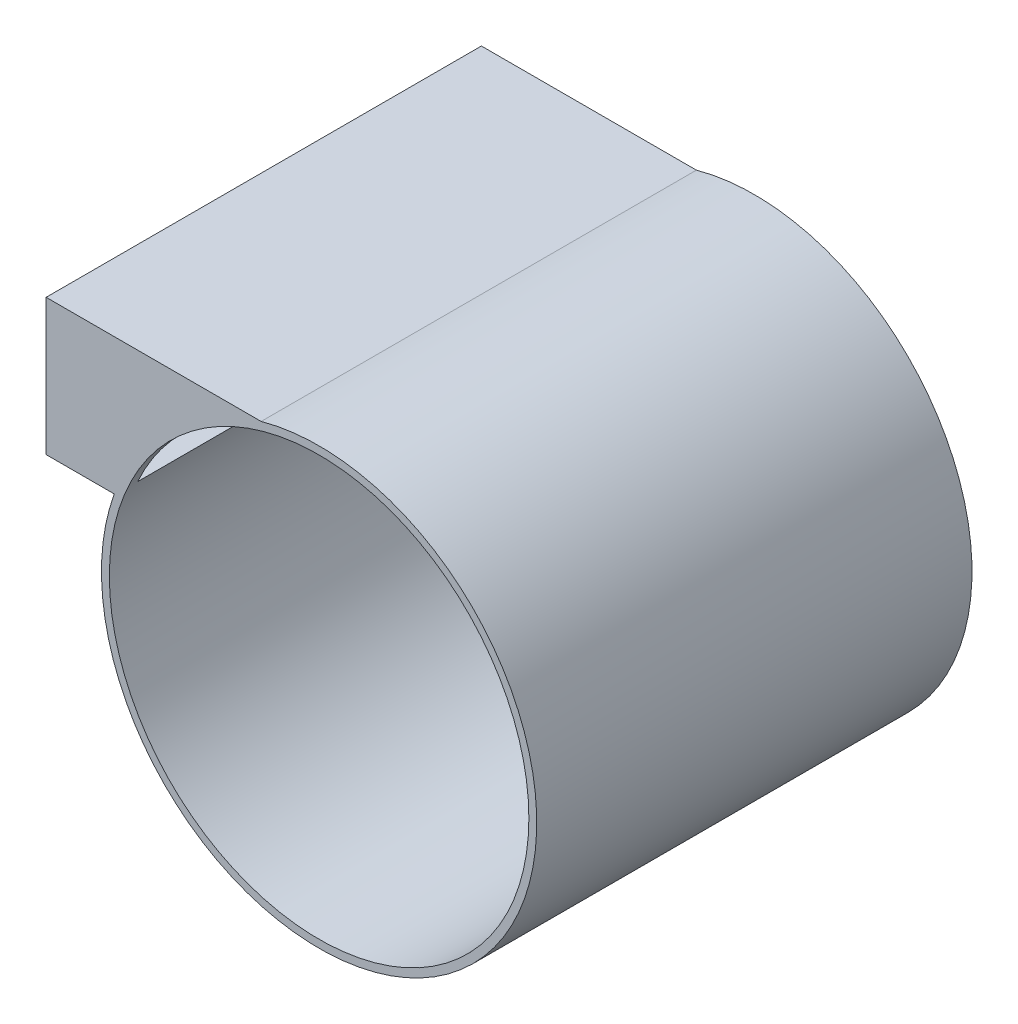
ISO-10303-21;
HEADER;
FILE_DESCRIPTION(('STEP AP214'),'2;1');
FILE_NAME('part.step','',(''),(''),'','','');
FILE_SCHEMA(('AUTOMOTIVE_DESIGN { 1 0 10303 214 1 1 1 1 }'));
ENDSEC;
DATA;
#1=APPLICATION_CONTEXT('core data for automotive mechanical design processes');
#2=APPLICATION_PROTOCOL_DEFINITION('international standard','automotive_design',2000,#1);
#3=PRODUCT_CONTEXT('',#1,'mechanical');
#4=PRODUCT('Part','Part','',(#3));
#5=PRODUCT_RELATED_PRODUCT_CATEGORY('part','',(#4));
#6=PRODUCT_DEFINITION_FORMATION('','',#4);
#7=PRODUCT_DEFINITION_CONTEXT('part definition',#1,'design');
#8=PRODUCT_DEFINITION('design','',#6,#7);
#9=PRODUCT_DEFINITION_SHAPE('','',#8);
#10=(LENGTH_UNIT() NAMED_UNIT(*) SI_UNIT(.MILLI.,.METRE.));
#11=(NAMED_UNIT(*) PLANE_ANGLE_UNIT() SI_UNIT($,.RADIAN.));
#12=(NAMED_UNIT(*) SI_UNIT($,.STERADIAN.) SOLID_ANGLE_UNIT());
#13=UNCERTAINTY_MEASURE_WITH_UNIT(LENGTH_MEASURE(1.E-05),#10,'distance_accuracy_value','');
#14=(GEOMETRIC_REPRESENTATION_CONTEXT(3) GLOBAL_UNCERTAINTY_ASSIGNED_CONTEXT((#13)) GLOBAL_UNIT_ASSIGNED_CONTEXT((#10,
#11,#12)) REPRESENTATION_CONTEXT('',''));
#15=CARTESIAN_POINT('',(0.,0.,0.));
#16=DIRECTION('',(0.,0.,1.));
#17=DIRECTION('',(1.,0.,0.));
#18=AXIS2_PLACEMENT_3D('',#15,#16,#17);
#19=CARTESIAN_POINT('',(0.,0.,210.82));
#20=DIRECTION('',(0.,0.,-1.));
#21=DIRECTION('',(-1.,0.,0.));
#22=AXIS2_PLACEMENT_3D('',#19,#20,#21);
#23=CYLINDRICAL_SURFACE('',#22,105.41);
#24=CARTESIAN_POINT('',(0.,0.,210.82));
#25=DIRECTION('',(0.,0.,1.));
#26=DIRECTION('',(1.,0.,0.));
#27=AXIS2_PLACEMENT_3D('',#24,#25,#26);
#28=CIRCLE('',#27,105.41);
#29=CARTESIAN_POINT('',(-99.2147952804439,35.604669601888,210.82));
#30=VERTEX_POINT('',#29);
#31=CARTESIAN_POINT('',(-28.0839473721199,101.6,210.82));
#32=VERTEX_POINT('',#31);
#33=EDGE_CURVE('E43',#30,#32,#28,.T.);
#34=ORIENTED_EDGE('',*,*,#33,.F.);
#35=DIRECTION('',(0.,0.,-1.));
#36=VECTOR('',#35,1.);
#37=CARTESIAN_POINT('',(-99.2147952804439,35.604669601888,210.82));
#38=LINE('',#37,#36);
#39=CARTESIAN_POINT('',(-99.2147952804439,35.604669601888,0.));
#40=VERTEX_POINT('',#39);
#41=EDGE_CURVE('E150',#30,#40,#38,.T.);
#42=ORIENTED_EDGE('',*,*,#41,.T.);
#43=CARTESIAN_POINT('',(0.,0.,0.));
#44=DIRECTION('',(0.,0.,1.));
#45=DIRECTION('',(1.,0.,0.));
#46=AXIS2_PLACEMENT_3D('',#43,#44,#45);
#47=CIRCLE('',#46,105.41);
#48=CARTESIAN_POINT('',(-28.0839473721199,101.6,0.));
#49=VERTEX_POINT('',#48);
#50=EDGE_CURVE('E156',#40,#49,#47,.T.);
#51=ORIENTED_EDGE('',*,*,#50,.T.);
#52=DIRECTION('',(0.,0.,-1.));
#53=VECTOR('',#52,1.);
#54=CARTESIAN_POINT('',(-28.0839473721199,101.6,210.82));
#55=LINE('',#54,#53);
#56=EDGE_CURVE('E145',#49,#32,#55,.F.);
#57=ORIENTED_EDGE('',*,*,#56,.T.);
#58=EDGE_LOOP('',(#34,#42,#51,#57));
#59=FACE_BOUND('',#58,.T.);
#60=ADVANCED_FACE('F36',(#59),#23,.T.);
#61=CARTESIAN_POINT('',(0.,0.,210.82));
#62=DIRECTION('',(0.,0.,1.));
#63=DIRECTION('',(1.,0.,0.));
#64=AXIS2_PLACEMENT_3D('',#61,#62,#63);
#65=PLANE('',#64);
#66=CARTESIAN_POINT('',(0.,0.,210.82));
#67=DIRECTION('',(0.,0.,1.));
#68=DIRECTION('',(1.,0.,0.));
#69=AXIS2_PLACEMENT_3D('',#66,#67,#68);
#70=CIRCLE('',#69,101.6);
#71=CARTESIAN_POINT('',(101.6,0.,210.82));
#72=VERTEX_POINT('',#71);
#73=EDGE_CURVE('E153',#72,#72,#70,.T.);
#74=ORIENTED_EDGE('',*,*,#73,.F.);
#75=EDGE_LOOP('',(#74));
#76=FACE_BOUND('',#75,.T.);
#77=ORIENTED_EDGE('',*,*,#33,.T.);
#78=DIRECTION('',(-1.,0.,0.));
#79=VECTOR('',#78,1.);
#80=CARTESIAN_POINT('',(0.,101.6,210.82));
#81=LINE('',#80,#79);
#82=CARTESIAN_POINT('',(-132.216629508652,101.6,210.82));
#83=VERTEX_POINT('',#82);
#84=EDGE_CURVE('E129',#32,#83,#81,.T.);
#85=ORIENTED_EDGE('',*,*,#84,.T.);
#86=DIRECTION('',(0.,-1.,0.));
#87=VECTOR('',#86,1.);
#88=CARTESIAN_POINT('',(-132.216629508652,35.604669601888,210.82));
#89=LINE('',#88,#87);
#90=CARTESIAN_POINT('',(-132.216629508652,35.604669601888,210.82));
#91=VERTEX_POINT('',#90);
#92=EDGE_CURVE('E131',#83,#91,#89,.T.);
#93=ORIENTED_EDGE('',*,*,#92,.T.);
#94=DIRECTION('',(1.,0.,0.));
#95=VECTOR('',#94,1.);
#96=CARTESIAN_POINT('',(0.,35.604669601888,210.82));
#97=LINE('',#96,#95);
#98=EDGE_CURVE('E57',#91,#30,#97,.T.);
#99=ORIENTED_EDGE('',*,*,#98,.T.);
#100=EDGE_LOOP('',(#77,#85,#93,#99));
#101=FACE_BOUND('',#100,.T.);
#102=ADVANCED_FACE('F172',(#76,#101),#65,.T.);
#103=CARTESIAN_POINT('',(0.,0.,0.));
#104=DIRECTION('',(0.,0.,1.));
#105=DIRECTION('',(1.,0.,0.));
#106=AXIS2_PLACEMENT_3D('',#103,#104,#105);
#107=PLANE('',#106);
#108=ORIENTED_EDGE('',*,*,#50,.F.);
#109=DIRECTION('',(1.,0.,0.));
#110=VECTOR('',#109,1.);
#111=CARTESIAN_POINT('',(0.,35.604669601888,0.));
#112=LINE('',#111,#110);
#113=CARTESIAN_POINT('',(-132.216629508652,35.604669601888,0.));
#114=VERTEX_POINT('',#113);
#115=EDGE_CURVE('E140',#114,#40,#112,.T.);
#116=ORIENTED_EDGE('',*,*,#115,.F.);
#117=DIRECTION('',(0.,-1.,0.));
#118=VECTOR('',#117,1.);
#119=CARTESIAN_POINT('',(-132.216629508652,35.604669601888,0.));
#120=LINE('',#119,#118);
#121=CARTESIAN_POINT('',(-132.216629508652,101.6,0.));
#122=VERTEX_POINT('',#121);
#123=EDGE_CURVE('E137',#122,#114,#120,.T.);
#124=ORIENTED_EDGE('',*,*,#123,.F.);
#125=DIRECTION('',(-1.,0.,0.));
#126=VECTOR('',#125,1.);
#127=CARTESIAN_POINT('',(0.,101.6,0.));
#128=LINE('',#127,#126);
#129=EDGE_CURVE('E135',#49,#122,#128,.T.);
#130=ORIENTED_EDGE('',*,*,#129,.F.);
#131=EDGE_LOOP('',(#108,#116,#124,#130));
#132=FACE_BOUND('',#131,.T.);
#133=ADVANCED_FACE('F164',(#132),#107,.F.);
#134=CARTESIAN_POINT('',(0.,0.,7.62000000000002));
#135=DIRECTION('',(0.,0.,1.));
#136=DIRECTION('',(1.,0.,0.));
#137=AXIS2_PLACEMENT_3D('',#134,#135,#136);
#138=CYLINDRICAL_SURFACE('',#137,101.6);
#139=DIRECTION('',(0.,0.,1.));
#140=VECTOR('',#139,1.);
#141=CARTESIAN_POINT('',(-33.2599823026873,96.0017373656588,63.246));
#142=LINE('',#141,#140);
#143=CARTESIAN_POINT('',(-33.2599823026873,96.0017373656588,5.25795336462656));
#144=VERTEX_POINT('',#143);
#145=CARTESIAN_POINT('',(-33.2599823026873,96.0017373656588,206.057555958095));
#146=VERTEX_POINT('',#145);
#147=EDGE_CURVE('E110',#144,#146,#142,.T.);
#148=ORIENTED_EDGE('',*,*,#147,.F.);
#149=CARTESIAN_POINT('',(0.,0.,5.25795336462656));
#150=DIRECTION('',(0.,0.,-1.));
#151=DIRECTION('',(-1.,0.,0.));
#152=AXIS2_PLACEMENT_3D('',#149,#150,#151);
#153=CIRCLE('',#152,101.6);
#154=CARTESIAN_POINT('',(-92.6539068995931,41.6870907625074,5.25795336462656));
#155=VERTEX_POINT('',#154);
#156=EDGE_CURVE('E106',#155,#144,#153,.T.);
#157=ORIENTED_EDGE('',*,*,#156,.F.);
#158=DIRECTION('',(0.,0.,1.));
#159=VECTOR('',#158,1.);
#160=CARTESIAN_POINT('',(-92.6539068995931,41.6870907625074,63.246));
#161=LINE('',#160,#159);
#162=CARTESIAN_POINT('',(-92.6539068995931,41.6870907625074,206.057555958095));
#163=VERTEX_POINT('',#162);
#164=EDGE_CURVE('E11',#163,#155,#161,.F.);
#165=ORIENTED_EDGE('',*,*,#164,.F.);
#166=CARTESIAN_POINT('',(0.,0.,206.057555958095));
#167=DIRECTION('',(0.,0.,1.));
#168=DIRECTION('',(1.,0.,0.));
#169=AXIS2_PLACEMENT_3D('',#166,#167,#168);
#170=CIRCLE('',#169,101.6);
#171=EDGE_CURVE('E113',#146,#163,#170,.T.);
#172=ORIENTED_EDGE('',*,*,#171,.F.);
#173=EDGE_LOOP('',(#148,#157,#165,#172));
#174=FACE_BOUND('',#173,.T.);
#175=ORIENTED_EDGE('',*,*,#73,.T.);
#176=EDGE_LOOP('',(#175));
#177=FACE_BOUND('',#176,.T.);
#178=CARTESIAN_POINT('',(0.,0.,2.53999999999992));
#179=DIRECTION('',(0.,0.,1.));
#180=DIRECTION('',(1.,0.,0.));
#181=AXIS2_PLACEMENT_3D('',#178,#179,#180);
#182=CIRCLE('',#181,101.6);
#183=CARTESIAN_POINT('',(101.6,0.,2.53999999999992));
#184=VERTEX_POINT('',#183);
#185=EDGE_CURVE('E114',#184,#184,#182,.T.);
#186=ORIENTED_EDGE('',*,*,#185,.F.);
#187=EDGE_LOOP('',(#186));
#188=FACE_BOUND('',#187,.T.);
#189=ADVANCED_FACE('F107',(#174,#177,#188),#138,.F.);
#190=CARTESIAN_POINT('',(0.,35.604669601888,0.));
#191=DIRECTION('',(0.,-1.,0.));
#192=DIRECTION('',(0.,0.,-1.));
#193=AXIS2_PLACEMENT_3D('',#190,#191,#192);
#194=PLANE('',#193);
#195=ORIENTED_EDGE('',*,*,#41,.F.);
#196=ORIENTED_EDGE('',*,*,#98,.F.);
#197=DIRECTION('',(0.,0.,1.));
#198=VECTOR('',#197,1.);
#199=CARTESIAN_POINT('',(-132.216629508652,35.604669601888,0.));
#200=LINE('',#199,#198);
#201=EDGE_CURVE('E143',#114,#91,#200,.T.);
#202=ORIENTED_EDGE('',*,*,#201,.F.);
#203=ORIENTED_EDGE('',*,*,#115,.T.);
#204=EDGE_LOOP('',(#195,#196,#202,#203));
#205=FACE_BOUND('',#204,.T.);
#206=ADVANCED_FACE('F174',(#205),#194,.T.);
#207=CARTESIAN_POINT('',(0.,101.6,0.));
#208=DIRECTION('',(0.,1.,0.));
#209=DIRECTION('',(-1.,0.,0.));
#210=AXIS2_PLACEMENT_3D('',#207,#208,#209);
#211=PLANE('',#210);
#212=ORIENTED_EDGE('',*,*,#56,.F.);
#213=ORIENTED_EDGE('',*,*,#129,.T.);
#214=DIRECTION('',(0.,0.,1.));
#215=VECTOR('',#214,1.);
#216=CARTESIAN_POINT('',(-132.216629508652,101.6,0.));
#217=LINE('',#216,#215);
#218=EDGE_CURVE('E142',#122,#83,#217,.T.);
#219=ORIENTED_EDGE('',*,*,#218,.T.);
#220=ORIENTED_EDGE('',*,*,#84,.F.);
#221=EDGE_LOOP('',(#212,#213,#219,#220));
#222=FACE_BOUND('',#221,.T.);
#223=ADVANCED_FACE('F168',(#222),#211,.T.);
#224=CARTESIAN_POINT('',(-132.216629508652,35.604669601888,0.));
#225=DIRECTION('',(-1.,0.,0.));
#226=DIRECTION('',(0.,0.,1.));
#227=AXIS2_PLACEMENT_3D('',#224,#225,#226);
#228=PLANE('',#227);
#229=DIRECTION('',(0.,-1.,0.));
#230=VECTOR('',#229,1.);
#231=CARTESIAN_POINT('',(-132.216629508652,41.6870907625074,5.25795336462656));
#232=LINE('',#231,#230);
#233=CARTESIAN_POINT('',(-132.216629508652,96.0017373656588,5.25795336462656));
#234=VERTEX_POINT('',#233);
#235=CARTESIAN_POINT('',(-132.216629508652,41.6870907625074,5.25795336462656));
#236=VERTEX_POINT('',#235);
#237=EDGE_CURVE('E118',#234,#236,#232,.T.);
#238=ORIENTED_EDGE('',*,*,#237,.F.);
#239=DIRECTION('',(0.,0.,-1.));
#240=VECTOR('',#239,1.);
#241=CARTESIAN_POINT('',(-132.216629508652,96.0017373656588,5.25795336462656));
#242=LINE('',#241,#240);
#243=CARTESIAN_POINT('',(-132.216629508652,96.0017373656588,206.057555958095));
#244=VERTEX_POINT('',#243);
#245=EDGE_CURVE('E120',#244,#234,#242,.T.);
#246=ORIENTED_EDGE('',*,*,#245,.F.);
#247=DIRECTION('',(0.,1.,0.));
#248=VECTOR('',#247,1.);
#249=CARTESIAN_POINT('',(-132.216629508652,41.6870907625074,206.057555958095));
#250=LINE('',#249,#248);
#251=CARTESIAN_POINT('',(-132.216629508652,41.6870907625074,206.057555958095));
#252=VERTEX_POINT('',#251);
#253=EDGE_CURVE('E125',#252,#244,#250,.T.);
#254=ORIENTED_EDGE('',*,*,#253,.F.);
#255=DIRECTION('',(0.,0.,1.));
#256=VECTOR('',#255,1.);
#257=CARTESIAN_POINT('',(-132.216629508652,41.6870907625074,5.25795336462656));
#258=LINE('',#257,#256);
#259=EDGE_CURVE('E203',#236,#252,#258,.T.);
#260=ORIENTED_EDGE('',*,*,#259,.F.);
#261=EDGE_LOOP('',(#238,#246,#254,#260));
#262=FACE_BOUND('',#261,.T.);
#263=ORIENTED_EDGE('',*,*,#201,.T.);
#264=ORIENTED_EDGE('',*,*,#92,.F.);
#265=ORIENTED_EDGE('',*,*,#218,.F.);
#266=ORIENTED_EDGE('',*,*,#123,.T.);
#267=EDGE_LOOP('',(#263,#264,#265,#266));
#268=FACE_BOUND('',#267,.T.);
#269=ADVANCED_FACE('F171',(#262,#268),#228,.T.);
#270=CARTESIAN_POINT('',(15.3573704913476,41.6870907625074,5.25795336462656));
#271=DIRECTION('',(0.,0.,-1.));
#272=DIRECTION('',(-1.,0.,0.));
#273=AXIS2_PLACEMENT_3D('',#270,#271,#272);
#274=PLANE('',#273);
#275=DIRECTION('',(-1.,0.,0.));
#276=VECTOR('',#275,1.);
#277=CARTESIAN_POINT('',(15.3573704913476,41.6870907625074,5.25795336462656));
#278=LINE('',#277,#276);
#279=EDGE_CURVE('E49',#155,#236,#278,.T.);
#280=ORIENTED_EDGE('',*,*,#279,.F.);
#281=ORIENTED_EDGE('',*,*,#156,.T.);
#282=DIRECTION('',(-1.,0.,0.));
#283=VECTOR('',#282,1.);
#284=CARTESIAN_POINT('',(15.3573704913476,96.0017373656588,5.25795336462656));
#285=LINE('',#284,#283);
#286=EDGE_CURVE('E132',#144,#234,#285,.T.);
#287=ORIENTED_EDGE('',*,*,#286,.T.);
#288=ORIENTED_EDGE('',*,*,#237,.T.);
#289=EDGE_LOOP('',(#280,#281,#287,#288));
#290=FACE_BOUND('',#289,.T.);
#291=ADVANCED_FACE('F116',(#290),#274,.F.);
#292=CARTESIAN_POINT('',(15.3573704913476,96.0017373656588,5.25795336462656));
#293=DIRECTION('',(0.,1.,0.));
#294=DIRECTION('',(0.,0.,1.));
#295=AXIS2_PLACEMENT_3D('',#292,#293,#294);
#296=PLANE('',#295);
#297=ORIENTED_EDGE('',*,*,#286,.F.);
#298=ORIENTED_EDGE('',*,*,#147,.T.);
#299=DIRECTION('',(-1.,0.,0.));
#300=VECTOR('',#299,1.);
#301=CARTESIAN_POINT('',(15.3573704913476,96.0017373656588,206.057555958095));
#302=LINE('',#301,#300);
#303=EDGE_CURVE('E122',#146,#244,#302,.T.);
#304=ORIENTED_EDGE('',*,*,#303,.T.);
#305=ORIENTED_EDGE('',*,*,#245,.T.);
#306=EDGE_LOOP('',(#297,#298,#304,#305));
#307=FACE_BOUND('',#306,.T.);
#308=ADVANCED_FACE('F200',(#307),#296,.F.);
#309=CARTESIAN_POINT('',(15.3573704913476,41.6870907625074,206.057555958095));
#310=DIRECTION('',(0.,0.,1.));
#311=DIRECTION('',(1.,0.,0.));
#312=AXIS2_PLACEMENT_3D('',#309,#310,#311);
#313=PLANE('',#312);
#314=ORIENTED_EDGE('',*,*,#303,.F.);
#315=ORIENTED_EDGE('',*,*,#171,.T.);
#316=DIRECTION('',(-1.,0.,0.));
#317=VECTOR('',#316,1.);
#318=CARTESIAN_POINT('',(15.3573704913476,41.6870907625074,206.057555958095));
#319=LINE('',#318,#317);
#320=EDGE_CURVE('E102',#163,#252,#319,.T.);
#321=ORIENTED_EDGE('',*,*,#320,.T.);
#322=ORIENTED_EDGE('',*,*,#253,.T.);
#323=EDGE_LOOP('',(#314,#315,#321,#322));
#324=FACE_BOUND('',#323,.T.);
#325=ADVANCED_FACE('F214',(#324),#313,.F.);
#326=CARTESIAN_POINT('',(15.3573704913476,41.6870907625074,5.25795336462656));
#327=DIRECTION('',(0.,-1.,0.));
#328=DIRECTION('',(0.,0.,-1.));
#329=AXIS2_PLACEMENT_3D('',#326,#327,#328);
#330=PLANE('',#329);
#331=ORIENTED_EDGE('',*,*,#164,.T.);
#332=ORIENTED_EDGE('',*,*,#279,.T.);
#333=ORIENTED_EDGE('',*,*,#259,.T.);
#334=ORIENTED_EDGE('',*,*,#320,.F.);
#335=EDGE_LOOP('',(#331,#332,#333,#334));
#336=FACE_BOUND('',#335,.T.);
#337=ADVANCED_FACE('F101',(#336),#330,.F.);
#338=CARTESIAN_POINT('',(0.,0.,2.53999999999992));
#339=DIRECTION('',(0.,0.,1.));
#340=DIRECTION('',(1.,0.,0.));
#341=AXIS2_PLACEMENT_3D('',#338,#339,#340);
#342=PLANE('',#341);
#343=ORIENTED_EDGE('',*,*,#185,.T.);
#344=EDGE_LOOP('',(#343));
#345=FACE_BOUND('',#344,.T.);
#346=ADVANCED_FACE('F219',(#345),#342,.T.);
#347=CLOSED_SHELL('',(#60,#102,#133,#189,#206,#223,#269,#291,#308,#325,#337,#346));
#348=MANIFOLD_SOLID_BREP('B2',#347);
#349=ADVANCED_BREP_SHAPE_REPRESENTATION('',(#18,#348),#14);
#350=SHAPE_DEFINITION_REPRESENTATION(#9,#349);
ENDSEC;
END-ISO-10303-21;
